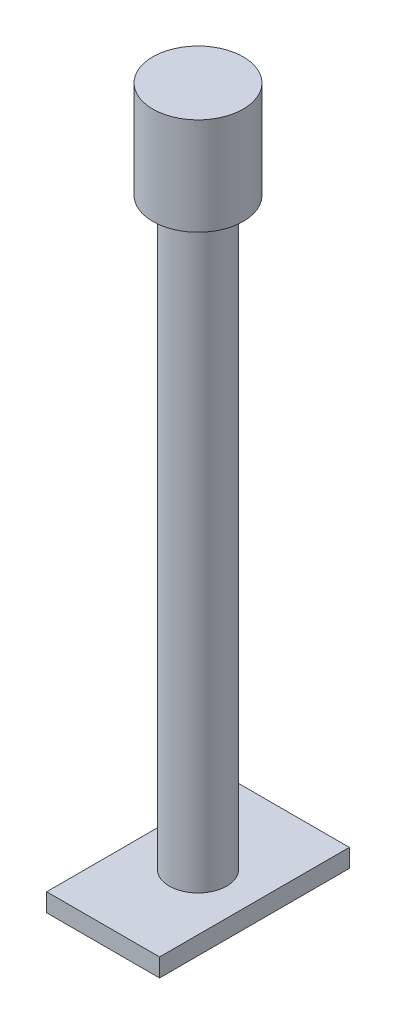
ISO-10303-21;
HEADER;
FILE_DESCRIPTION(('STEP AP214'),'2;1');
FILE_NAME('part.step','',(''),(''),'','','');
FILE_SCHEMA(('AUTOMOTIVE_DESIGN { 1 0 10303 214 1 1 1 1 }'));
ENDSEC;
DATA;
#1=APPLICATION_CONTEXT('core data for automotive mechanical design processes');
#2=APPLICATION_PROTOCOL_DEFINITION('international standard','automotive_design',2000,#1);
#3=PRODUCT_CONTEXT('',#1,'mechanical');
#4=PRODUCT('Part','Part','',(#3));
#5=PRODUCT_RELATED_PRODUCT_CATEGORY('part','',(#4));
#6=PRODUCT_DEFINITION_FORMATION('','',#4);
#7=PRODUCT_DEFINITION_CONTEXT('part definition',#1,'design');
#8=PRODUCT_DEFINITION('design','',#6,#7);
#9=PRODUCT_DEFINITION_SHAPE('','',#8);
#10=(LENGTH_UNIT() NAMED_UNIT(*) SI_UNIT(.MILLI.,.METRE.));
#11=(NAMED_UNIT(*) PLANE_ANGLE_UNIT() SI_UNIT($,.RADIAN.));
#12=(NAMED_UNIT(*) SI_UNIT($,.STERADIAN.) SOLID_ANGLE_UNIT());
#13=UNCERTAINTY_MEASURE_WITH_UNIT(LENGTH_MEASURE(1.E-05),#10,'distance_accuracy_value','');
#14=(GEOMETRIC_REPRESENTATION_CONTEXT(3) GLOBAL_UNCERTAINTY_ASSIGNED_CONTEXT((#13)) GLOBAL_UNIT_ASSIGNED_CONTEXT((#10,
#11,#12)) REPRESENTATION_CONTEXT('',''));
#15=CARTESIAN_POINT('',(0.,0.,0.));
#16=DIRECTION('',(0.,0.,1.));
#17=DIRECTION('',(1.,0.,0.));
#18=AXIS2_PLACEMENT_3D('',#15,#16,#17);
#19=CARTESIAN_POINT('',(0.,152.4,0.));
#20=DIRECTION('',(0.,-1.,0.));
#21=DIRECTION('',(0.,0.,-1.));
#22=AXIS2_PLACEMENT_3D('',#19,#20,#21);
#23=CYLINDRICAL_SURFACE('',#22,7.493);
#24=CARTESIAN_POINT('',(0.,152.4,0.));
#25=DIRECTION('',(0.,1.,0.));
#26=DIRECTION('',(0.,0.,1.));
#27=AXIS2_PLACEMENT_3D('',#24,#25,#26);
#28=CIRCLE('',#27,7.493);
#29=CARTESIAN_POINT('',(0.,152.4,-7.493));
#30=VERTEX_POINT('',#29);
#31=EDGE_CURVE('E11',#30,#30,#28,.T.);
#32=CARTESIAN_POINT('',(0.,0.,0.));
#33=DIRECTION('',(0.,1.,0.));
#34=DIRECTION('',(0.,0.,1.));
#35=AXIS2_PLACEMENT_3D('',#32,#33,#34);
#36=CIRCLE('',#35,7.493);
#37=CARTESIAN_POINT('',(0.,0.,-7.493));
#38=VERTEX_POINT('',#37);
#39=EDGE_CURVE('E37',#38,#38,#36,.T.);
#40=CARTESIAN_POINT('',(0.,152.4,-7.493));
#41=CARTESIAN_POINT('',(0.,150.8125,-7.493));
#42=CARTESIAN_POINT('',(0.,149.225,-7.493));
#43=CARTESIAN_POINT('',(0.,146.05,-7.493));
#44=CARTESIAN_POINT('',(0.,144.4625,-7.493));
#45=CARTESIAN_POINT('',(0.,141.2875,-7.493));
#46=CARTESIAN_POINT('',(0.,139.7,-7.493));
#47=CARTESIAN_POINT('',(0.,136.525,-7.493));
#48=CARTESIAN_POINT('',(0.,134.9375,-7.493));
#49=CARTESIAN_POINT('',(0.,131.7625,-7.493));
#50=CARTESIAN_POINT('',(0.,130.175,-7.493));
#51=CARTESIAN_POINT('',(0.,127.,-7.493));
#52=CARTESIAN_POINT('',(0.,125.4125,-7.493));
#53=CARTESIAN_POINT('',(0.,122.2375,-7.493));
#54=CARTESIAN_POINT('',(0.,120.65,-7.493));
#55=CARTESIAN_POINT('',(0.,117.475,-7.493));
#56=CARTESIAN_POINT('',(0.,115.8875,-7.493));
#57=CARTESIAN_POINT('',(0.,112.7125,-7.493));
#58=CARTESIAN_POINT('',(0.,111.125,-7.493));
#59=CARTESIAN_POINT('',(0.,107.95,-7.493));
#60=CARTESIAN_POINT('',(0.,106.3625,-7.493));
#61=CARTESIAN_POINT('',(0.,103.1875,-7.493));
#62=CARTESIAN_POINT('',(0.,101.6,-7.493));
#63=CARTESIAN_POINT('',(0.,98.425,-7.493));
#64=CARTESIAN_POINT('',(0.,96.8375,-7.493));
#65=CARTESIAN_POINT('',(0.,93.6625,-7.493));
#66=CARTESIAN_POINT('',(0.,92.075,-7.493));
#67=CARTESIAN_POINT('',(0.,88.9,-7.493));
#68=CARTESIAN_POINT('',(0.,87.3125,-7.493));
#69=CARTESIAN_POINT('',(0.,84.1375,-7.493));
#70=CARTESIAN_POINT('',(0.,82.55,-7.493));
#71=CARTESIAN_POINT('',(0.,79.375,-7.493));
#72=CARTESIAN_POINT('',(0.,77.7875,-7.493));
#73=CARTESIAN_POINT('',(0.,74.6125,-7.493));
#74=CARTESIAN_POINT('',(0.,73.025,-7.493));
#75=CARTESIAN_POINT('',(0.,69.85,-7.493));
#76=CARTESIAN_POINT('',(0.,68.2625,-7.493));
#77=CARTESIAN_POINT('',(0.,65.0875,-7.493));
#78=CARTESIAN_POINT('',(0.,63.5,-7.493));
#79=CARTESIAN_POINT('',(0.,60.325,-7.493));
#80=CARTESIAN_POINT('',(0.,58.7375,-7.493));
#81=CARTESIAN_POINT('',(0.,55.5625,-7.493));
#82=CARTESIAN_POINT('',(0.,53.975,-7.493));
#83=CARTESIAN_POINT('',(0.,50.8,-7.493));
#84=CARTESIAN_POINT('',(0.,49.2125,-7.493));
#85=CARTESIAN_POINT('',(0.,46.0375,-7.493));
#86=CARTESIAN_POINT('',(0.,44.45,-7.493));
#87=CARTESIAN_POINT('',(0.,41.275,-7.493));
#88=CARTESIAN_POINT('',(0.,39.6875,-7.493));
#89=CARTESIAN_POINT('',(0.,36.5125,-7.493));
#90=CARTESIAN_POINT('',(0.,34.925,-7.493));
#91=CARTESIAN_POINT('',(0.,31.75,-7.493));
#92=CARTESIAN_POINT('',(0.,30.1625,-7.493));
#93=CARTESIAN_POINT('',(0.,26.9875,-7.493));
#94=CARTESIAN_POINT('',(0.,25.4,-7.493));
#95=CARTESIAN_POINT('',(0.,22.225,-7.493));
#96=CARTESIAN_POINT('',(0.,20.6375,-7.493));
#97=CARTESIAN_POINT('',(0.,17.4625,-7.493));
#98=CARTESIAN_POINT('',(0.,15.875,-7.493));
#99=CARTESIAN_POINT('',(0.,12.7,-7.493));
#100=CARTESIAN_POINT('',(0.,11.1125,-7.493));
#101=CARTESIAN_POINT('',(0.,7.93750000000001,-7.493));
#102=CARTESIAN_POINT('',(0.,6.35,-7.493));
#103=CARTESIAN_POINT('',(0.,3.175,-7.493));
#104=CARTESIAN_POINT('',(0.,1.5875,-7.493));
#105=CARTESIAN_POINT('',(0.,0.,-7.493));
#106=B_SPLINE_CURVE_WITH_KNOTS('',3,(#40,#41,#42,#43,#44,#45,#46,#47,#48,#49,#50,#51,#52,#53,
#54,#55,#56,#57,#58,#59,#60,#61,#62,#63,#64,#65,#66,#67,#68,#69,#70,#71,#72,#73,#74,#75,#76,#77,
#78,#79,#80,#81,#82,#83,#84,#85,#86,#87,#88,#89,#90,#91,#92,#93,#94,#95,#96,#97,#98,#99,#100,
#101,#102,#103,#104,#105),.UNSPECIFIED.,.F.,.F.,(4,2,2,2,2,2,2,2,2,2,2,2,2,2,2,2,2,2,2,2,2,2,2,
2,2,2,2,2,2,2,2,2,4),(0.,4.76249999999998,9.52499999999998,14.2875,19.05,23.8125,28.575,33.3375,
38.1,42.8625,47.625,52.3875,57.15,61.9125,66.675,71.4375,76.2,80.9625,85.725,90.4875,95.25,
100.0125,104.775,109.5375,114.3,119.0625,123.825,128.5875,133.35,138.1125,142.875,147.6375,
152.4),.UNSPECIFIED.);
#107=EDGE_CURVE('BSEAM34',#30,#38,#106,.T.);
#108=ORIENTED_EDGE('',*,*,#31,.F.);
#109=ORIENTED_EDGE('',*,*,#39,.T.);
#110=ORIENTED_EDGE('',*,*,#107,.T.);
#111=ORIENTED_EDGE('',*,*,#107,.F.);
#112=EDGE_LOOP('',(#108,#110,#109,#111));
#113=FACE_BOUND('',#112,.T.);
#114=ADVANCED_FACE('F34',(#113),#23,.T.);
#115=CARTESIAN_POINT('',(14.732,-4.7625,24.765));
#116=DIRECTION('',(-1.,0.,0.));
#117=DIRECTION('',(0.,0.,1.));
#118=AXIS2_PLACEMENT_3D('',#115,#116,#117);
#119=PLANE('',#118);
#120=DIRECTION('',(0.,0.,1.));
#121=VECTOR('',#120,1.);
#122=CARTESIAN_POINT('',(14.732,0.,24.765));
#123=LINE('',#122,#121);
#124=CARTESIAN_POINT('',(14.732,0.,-24.765));
#125=VERTEX_POINT('',#124);
#126=CARTESIAN_POINT('',(14.732,0.,24.765));
#127=VERTEX_POINT('',#126);
#128=EDGE_CURVE('E101',#125,#127,#123,.T.);
#129=ORIENTED_EDGE('',*,*,#128,.T.);
#130=DIRECTION('',(0.,1.,0.));
#131=VECTOR('',#130,1.);
#132=CARTESIAN_POINT('',(14.732,-4.7625,24.765));
#133=LINE('',#132,#131);
#134=CARTESIAN_POINT('',(14.732,-4.7625,24.765));
#135=VERTEX_POINT('',#134);
#136=EDGE_CURVE('E92',#135,#127,#133,.T.);
#137=ORIENTED_EDGE('',*,*,#136,.F.);
#138=DIRECTION('',(0.,0.,1.));
#139=VECTOR('',#138,1.);
#140=CARTESIAN_POINT('',(14.732,-4.7625,24.765));
#141=LINE('',#140,#139);
#142=CARTESIAN_POINT('',(14.732,-4.7625,-24.765));
#143=VERTEX_POINT('',#142);
#144=EDGE_CURVE('E86',#143,#135,#141,.T.);
#145=ORIENTED_EDGE('',*,*,#144,.F.);
#146=DIRECTION('',(0.,1.,0.));
#147=VECTOR('',#146,1.);
#148=CARTESIAN_POINT('',(14.732,-4.7625,-24.765));
#149=LINE('',#148,#147);
#150=EDGE_CURVE('E97',#143,#125,#149,.T.);
#151=ORIENTED_EDGE('',*,*,#150,.T.);
#152=EDGE_LOOP('',(#129,#137,#145,#151));
#153=FACE_BOUND('',#152,.T.);
#154=ADVANCED_FACE('F121',(#153),#119,.F.);
#155=CARTESIAN_POINT('',(-14.732,-4.7625,24.765));
#156=DIRECTION('',(0.,0.,-1.));
#157=DIRECTION('',(-1.,0.,0.));
#158=AXIS2_PLACEMENT_3D('',#155,#156,#157);
#159=PLANE('',#158);
#160=DIRECTION('',(-1.,0.,0.));
#161=VECTOR('',#160,1.);
#162=CARTESIAN_POINT('',(-14.732,0.,24.765));
#163=LINE('',#162,#161);
#164=CARTESIAN_POINT('',(-14.732,0.,24.765));
#165=VERTEX_POINT('',#164);
#166=EDGE_CURVE('E91',#127,#165,#163,.T.);
#167=ORIENTED_EDGE('',*,*,#166,.T.);
#168=DIRECTION('',(0.,1.,0.));
#169=VECTOR('',#168,1.);
#170=CARTESIAN_POINT('',(-14.732,-4.7625,24.765));
#171=LINE('',#170,#169);
#172=CARTESIAN_POINT('',(-14.732,-4.7625,24.765));
#173=VERTEX_POINT('',#172);
#174=EDGE_CURVE('E89',#173,#165,#171,.T.);
#175=ORIENTED_EDGE('',*,*,#174,.F.);
#176=DIRECTION('',(-1.,0.,0.));
#177=VECTOR('',#176,1.);
#178=CARTESIAN_POINT('',(-14.732,-4.7625,24.765));
#179=LINE('',#178,#177);
#180=EDGE_CURVE('E81',#135,#173,#179,.T.);
#181=ORIENTED_EDGE('',*,*,#180,.F.);
#182=ORIENTED_EDGE('',*,*,#136,.T.);
#183=EDGE_LOOP('',(#167,#175,#181,#182));
#184=FACE_BOUND('',#183,.T.);
#185=ADVANCED_FACE('F90',(#184),#159,.F.);
#186=CARTESIAN_POINT('',(-14.732,-4.7625,24.765));
#187=DIRECTION('',(1.,0.,0.));
#188=DIRECTION('',(0.,0.,-1.));
#189=AXIS2_PLACEMENT_3D('',#186,#187,#188);
#190=PLANE('',#189);
#191=DIRECTION('',(0.,0.,-1.));
#192=VECTOR('',#191,1.);
#193=CARTESIAN_POINT('',(-14.732,0.,24.765));
#194=LINE('',#193,#192);
#195=CARTESIAN_POINT('',(-14.732,0.,-24.765));
#196=VERTEX_POINT('',#195);
#197=EDGE_CURVE('E67',#165,#196,#194,.T.);
#198=ORIENTED_EDGE('',*,*,#197,.T.);
#199=DIRECTION('',(0.,1.,0.));
#200=VECTOR('',#199,1.);
#201=CARTESIAN_POINT('',(-14.732,-4.7625,-24.765));
#202=LINE('',#201,#200);
#203=CARTESIAN_POINT('',(-14.732,-4.7625,-24.765));
#204=VERTEX_POINT('',#203);
#205=EDGE_CURVE('E93',#204,#196,#202,.T.);
#206=ORIENTED_EDGE('',*,*,#205,.F.);
#207=DIRECTION('',(0.,0.,-1.));
#208=VECTOR('',#207,1.);
#209=CARTESIAN_POINT('',(-14.732,-4.7625,24.765));
#210=LINE('',#209,#208);
#211=EDGE_CURVE('E84',#173,#204,#210,.T.);
#212=ORIENTED_EDGE('',*,*,#211,.F.);
#213=ORIENTED_EDGE('',*,*,#174,.T.);
#214=EDGE_LOOP('',(#198,#206,#212,#213));
#215=FACE_BOUND('',#214,.T.);
#216=ADVANCED_FACE('F95',(#215),#190,.F.);
#217=CARTESIAN_POINT('',(-14.732,-4.7625,-24.765));
#218=DIRECTION('',(0.,0.,1.));
#219=DIRECTION('',(1.,0.,0.));
#220=AXIS2_PLACEMENT_3D('',#217,#218,#219);
#221=PLANE('',#220);
#222=DIRECTION('',(1.,0.,0.));
#223=VECTOR('',#222,1.);
#224=CARTESIAN_POINT('',(-14.732,0.,-24.765));
#225=LINE('',#224,#223);
#226=EDGE_CURVE('E73',#196,#125,#225,.T.);
#227=ORIENTED_EDGE('',*,*,#226,.T.);
#228=ORIENTED_EDGE('',*,*,#150,.F.);
#229=DIRECTION('',(1.,0.,0.));
#230=VECTOR('',#229,1.);
#231=CARTESIAN_POINT('',(-14.732,-4.7625,-24.765));
#232=LINE('',#231,#230);
#233=EDGE_CURVE('E50',#204,#143,#232,.T.);
#234=ORIENTED_EDGE('',*,*,#233,.F.);
#235=ORIENTED_EDGE('',*,*,#205,.T.);
#236=EDGE_LOOP('',(#227,#228,#234,#235));
#237=FACE_BOUND('',#236,.T.);
#238=ADVANCED_FACE('F122',(#237),#221,.F.);
#239=CARTESIAN_POINT('',(0.,-4.7625,0.));
#240=DIRECTION('',(0.,-1.,0.));
#241=DIRECTION('',(0.,0.,-1.));
#242=AXIS2_PLACEMENT_3D('',#239,#240,#241);
#243=PLANE('',#242);
#244=ORIENTED_EDGE('',*,*,#144,.T.);
#245=ORIENTED_EDGE('',*,*,#180,.T.);
#246=ORIENTED_EDGE('',*,*,#211,.T.);
#247=ORIENTED_EDGE('',*,*,#233,.T.);
#248=EDGE_LOOP('',(#244,#245,#246,#247));
#249=FACE_BOUND('',#248,.T.);
#250=ADVANCED_FACE('F82',(#249),#243,.T.);
#251=CARTESIAN_POINT('',(0.,0.,0.));
#252=DIRECTION('',(0.,-1.,0.));
#253=DIRECTION('',(0.,0.,-1.));
#254=AXIS2_PLACEMENT_3D('',#251,#252,#253);
#255=PLANE('',#254);
#256=ORIENTED_EDGE('',*,*,#39,.F.);
#257=EDGE_LOOP('',(#256));
#258=FACE_BOUND('',#257,.T.);
#259=ORIENTED_EDGE('',*,*,#128,.F.);
#260=ORIENTED_EDGE('',*,*,#226,.F.);
#261=ORIENTED_EDGE('',*,*,#197,.F.);
#262=ORIENTED_EDGE('',*,*,#166,.F.);
#263=EDGE_LOOP('',(#259,#260,#261,#262));
#264=FACE_BOUND('',#263,.T.);
#265=ADVANCED_FACE('F114',(#258,#264),#255,.F.);
#266=CARTESIAN_POINT('',(0.,177.8,0.));
#267=DIRECTION('',(0.,-1.,0.));
#268=DIRECTION('',(0.,0.,-1.));
#269=AXIS2_PLACEMENT_3D('',#266,#267,#268);
#270=CYLINDRICAL_SURFACE('',#269,11.811);
#271=CARTESIAN_POINT('',(0.,177.8,0.));
#272=DIRECTION('',(0.,1.,0.));
#273=DIRECTION('',(0.,0.,1.));
#274=AXIS2_PLACEMENT_3D('',#271,#272,#273);
#275=CIRCLE('',#274,11.811);
#276=CARTESIAN_POINT('',(0.,177.8,11.811));
#277=VERTEX_POINT('',#276);
#278=EDGE_CURVE('E104',#277,#277,#275,.T.);
#279=ORIENTED_EDGE('',*,*,#278,.F.);
#280=EDGE_LOOP('',(#279));
#281=FACE_BOUND('',#280,.T.);
#282=CARTESIAN_POINT('',(0.,152.4,0.));
#283=DIRECTION('',(0.,1.,0.));
#284=DIRECTION('',(0.,0.,1.));
#285=AXIS2_PLACEMENT_3D('',#282,#283,#284);
#286=CIRCLE('',#285,11.811);
#287=CARTESIAN_POINT('',(0.,152.4,11.811));
#288=VERTEX_POINT('',#287);
#289=EDGE_CURVE('E145',#288,#288,#286,.T.);
#290=ORIENTED_EDGE('',*,*,#289,.T.);
#291=EDGE_LOOP('',(#290));
#292=FACE_BOUND('',#291,.T.);
#293=ADVANCED_FACE('F117',(#281,#292),#270,.T.);
#294=CARTESIAN_POINT('',(0.,177.8,0.));
#295=DIRECTION('',(0.,1.,0.));
#296=DIRECTION('',(0.,0.,1.));
#297=AXIS2_PLACEMENT_3D('',#294,#295,#296);
#298=PLANE('',#297);
#299=ORIENTED_EDGE('',*,*,#278,.T.);
#300=EDGE_LOOP('',(#299));
#301=FACE_BOUND('',#300,.T.);
#302=ADVANCED_FACE('F141',(#301),#298,.T.);
#303=CARTESIAN_POINT('',(0.,152.4,0.));
#304=DIRECTION('',(0.,1.,0.));
#305=DIRECTION('',(0.,0.,1.));
#306=AXIS2_PLACEMENT_3D('',#303,#304,#305);
#307=PLANE('',#306);
#308=ORIENTED_EDGE('',*,*,#31,.T.);
#309=EDGE_LOOP('',(#308));
#310=FACE_BOUND('',#309,.T.);
#311=ORIENTED_EDGE('',*,*,#289,.F.);
#312=EDGE_LOOP('',(#311));
#313=FACE_BOUND('',#312,.T.);
#314=ADVANCED_FACE('F138',(#310,#313),#307,.F.);
#315=CLOSED_SHELL('',(#114,#154,#185,#216,#238,#250,#265,#293,#302,#314));
#316=MANIFOLD_SOLID_BREP('B2',#315);
#317=ADVANCED_BREP_SHAPE_REPRESENTATION('',(#18,#316),#14);
#318=SHAPE_DEFINITION_REPRESENTATION(#9,#317);
ENDSEC;
END-ISO-10303-21;
